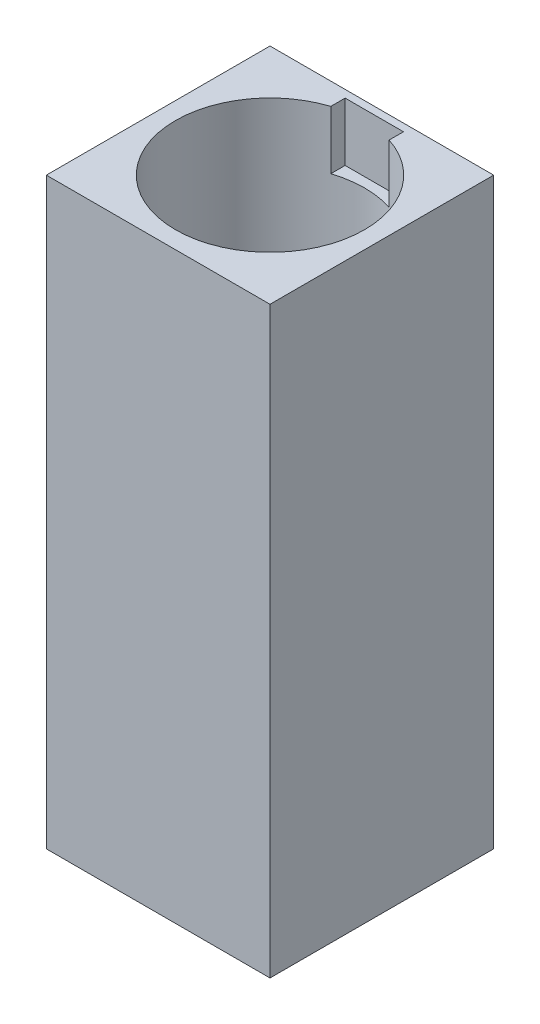
ISO-10303-21;
HEADER;
FILE_DESCRIPTION(('STEP AP214'),'2;1');
FILE_NAME('part.step','',(''),(''),'','','');
FILE_SCHEMA(('AUTOMOTIVE_DESIGN { 1 0 10303 214 1 1 1 1 }'));
ENDSEC;
DATA;
#1=APPLICATION_CONTEXT('core data for automotive mechanical design processes');
#2=APPLICATION_PROTOCOL_DEFINITION('international standard','automotive_design',2000,#1);
#3=PRODUCT_CONTEXT('',#1,'mechanical');
#4=PRODUCT('Part','Part','',(#3));
#5=PRODUCT_RELATED_PRODUCT_CATEGORY('part','',(#4));
#6=PRODUCT_DEFINITION_FORMATION('','',#4);
#7=PRODUCT_DEFINITION_CONTEXT('part definition',#1,'design');
#8=PRODUCT_DEFINITION('design','',#6,#7);
#9=PRODUCT_DEFINITION_SHAPE('','',#8);
#10=(LENGTH_UNIT() NAMED_UNIT(*) SI_UNIT(.MILLI.,.METRE.));
#11=(NAMED_UNIT(*) PLANE_ANGLE_UNIT() SI_UNIT($,.RADIAN.));
#12=(NAMED_UNIT(*) SI_UNIT($,.STERADIAN.) SOLID_ANGLE_UNIT());
#13=UNCERTAINTY_MEASURE_WITH_UNIT(LENGTH_MEASURE(1.E-05),#10,'distance_accuracy_value','');
#14=(GEOMETRIC_REPRESENTATION_CONTEXT(3) GLOBAL_UNCERTAINTY_ASSIGNED_CONTEXT((#13)) GLOBAL_UNIT_ASSIGNED_CONTEXT((#10,
#11,#12)) REPRESENTATION_CONTEXT('',''));
#15=CARTESIAN_POINT('',(0.,0.,0.));
#16=DIRECTION('',(0.,0.,1.));
#17=DIRECTION('',(1.,0.,0.));
#18=AXIS2_PLACEMENT_3D('',#15,#16,#17);
#19=CARTESIAN_POINT('',(0.,60.,0.));
#20=DIRECTION('',(0.,-1.,0.));
#21=DIRECTION('',(0.,0.,-1.));
#22=AXIS2_PLACEMENT_3D('',#19,#20,#21);
#23=PLANE('',#22);
#24=DIRECTION('',(0.,0.,-1.));
#25=VECTOR('',#24,1.);
#26=CARTESIAN_POINT('',(0.,60.,0.));
#27=LINE('',#26,#25);
#28=CARTESIAN_POINT('',(0.,60.,23.));
#29=VERTEX_POINT('',#28);
#30=CARTESIAN_POINT('',(0.,60.,0.));
#31=VERTEX_POINT('',#30);
#32=EDGE_CURVE('E154',#29,#31,#27,.T.);
#33=ORIENTED_EDGE('',*,*,#32,.T.);
#34=DIRECTION('',(-1.,0.,0.));
#35=VECTOR('',#34,1.);
#36=CARTESIAN_POINT('',(0.,60.,0.));
#37=LINE('',#36,#35);
#38=CARTESIAN_POINT('',(-23.,60.,0.));
#39=VERTEX_POINT('',#38);
#40=EDGE_CURVE('E91',#31,#39,#37,.T.);
#41=ORIENTED_EDGE('',*,*,#40,.T.);
#42=DIRECTION('',(0.,0.,1.));
#43=VECTOR('',#42,1.);
#44=CARTESIAN_POINT('',(-23.,60.,0.));
#45=LINE('',#44,#43);
#46=CARTESIAN_POINT('',(-23.,60.,23.));
#47=VERTEX_POINT('',#46);
#48=EDGE_CURVE('E157',#39,#47,#45,.T.);
#49=ORIENTED_EDGE('',*,*,#48,.T.);
#50=DIRECTION('',(1.,0.,0.));
#51=VECTOR('',#50,1.);
#52=CARTESIAN_POINT('',(0.,60.,23.));
#53=LINE('',#52,#51);
#54=EDGE_CURVE('E62',#47,#29,#53,.T.);
#55=ORIENTED_EDGE('',*,*,#54,.T.);
#56=EDGE_LOOP('',(#33,#41,#49,#55));
#57=FACE_BOUND('',#56,.T.);
#58=DIRECTION('',(0.,0.,-1.));
#59=VECTOR('',#58,1.);
#60=CARTESIAN_POINT('',(-14.5,60.,3.17371727131037));
#61=LINE('',#60,#59);
#62=CARTESIAN_POINT('',(-14.5,60.,2.24929056774563));
#63=VERTEX_POINT('',#62);
#64=CARTESIAN_POINT('',(-14.5,60.,0.775000000000002));
#65=VERTEX_POINT('',#64);
#66=EDGE_CURVE('E137',#63,#65,#61,.T.);
#67=ORIENTED_EDGE('',*,*,#66,.T.);
#68=DIRECTION('',(-1.,0.,0.));
#69=VECTOR('',#68,1.);
#70=CARTESIAN_POINT('',(-8.5,60.,0.775));
#71=LINE('',#70,#69);
#72=CARTESIAN_POINT('',(-8.5,60.,0.775));
#73=VERTEX_POINT('',#72);
#74=EDGE_CURVE('E125',#73,#65,#71,.T.);
#75=ORIENTED_EDGE('',*,*,#74,.F.);
#76=DIRECTION('',(0.,0.,-1.));
#77=VECTOR('',#76,1.);
#78=CARTESIAN_POINT('',(-8.5,60.,3.17371727131037));
#79=LINE('',#78,#77);
#80=CARTESIAN_POINT('',(-8.5,60.,2.24929056774563));
#81=VERTEX_POINT('',#80);
#82=EDGE_CURVE('E118',#81,#73,#79,.T.);
#83=ORIENTED_EDGE('',*,*,#82,.F.);
#84=CARTESIAN_POINT('',(-11.5,60.,11.5));
#85=DIRECTION('',(0.,1.,0.));
#86=DIRECTION('',(0.,0.,1.));
#87=AXIS2_PLACEMENT_3D('',#84,#85,#86);
#88=CIRCLE('',#87,9.725);
#89=EDGE_CURVE('E145',#63,#81,#88,.T.);
#90=ORIENTED_EDGE('',*,*,#89,.F.);
#91=EDGE_LOOP('',(#67,#75,#83,#90));
#92=FACE_BOUND('',#91,.T.);
#93=ADVANCED_FACE('F39',(#57,#92),#23,.F.);
#94=CARTESIAN_POINT('',(-11.5,21.,11.5));
#95=DIRECTION('',(0.,1.,0.));
#96=DIRECTION('',(0.,0.,1.));
#97=AXIS2_PLACEMENT_3D('',#94,#95,#96);
#98=CYLINDRICAL_SURFACE('',#97,9.725);
#99=CARTESIAN_POINT('',(-11.5,21.,11.5));
#100=DIRECTION('',(0.,1.,0.));
#101=DIRECTION('',(0.,0.,1.));
#102=AXIS2_PLACEMENT_3D('',#99,#100,#101);
#103=CIRCLE('',#102,9.725);
#104=CARTESIAN_POINT('',(-11.5,21.,21.225));
#105=VERTEX_POINT('',#104);
#106=EDGE_CURVE('E148',#105,#105,#103,.T.);
#107=ORIENTED_EDGE('',*,*,#106,.F.);
#108=EDGE_LOOP('',(#107));
#109=FACE_BOUND('',#108,.T.);
#110=DIRECTION('',(0.,1.,0.));
#111=VECTOR('',#110,1.);
#112=CARTESIAN_POINT('',(-14.5,21.,2.24929056774563));
#113=LINE('',#112,#111);
#114=CARTESIAN_POINT('',(-14.5,54.,2.24929056774563));
#115=VERTEX_POINT('',#114);
#116=EDGE_CURVE('E11',#63,#115,#113,.F.);
#117=ORIENTED_EDGE('',*,*,#116,.F.);
#118=ORIENTED_EDGE('',*,*,#89,.T.);
#119=DIRECTION('',(0.,1.,0.));
#120=VECTOR('',#119,1.);
#121=CARTESIAN_POINT('',(-8.5,21.,2.24929056774563));
#122=LINE('',#121,#120);
#123=CARTESIAN_POINT('',(-8.5,54.,2.24929056774563));
#124=VERTEX_POINT('',#123);
#125=EDGE_CURVE('E47',#81,#124,#122,.F.);
#126=ORIENTED_EDGE('',*,*,#125,.T.);
#127=CARTESIAN_POINT('',(-11.5,54.,11.5));
#128=DIRECTION('',(0.,-1.,0.));
#129=DIRECTION('',(0.,0.,-1.));
#130=AXIS2_PLACEMENT_3D('',#127,#128,#129);
#131=CIRCLE('',#130,9.725);
#132=EDGE_CURVE('E176',#124,#115,#131,.F.);
#133=ORIENTED_EDGE('',*,*,#132,.T.);
#134=EDGE_LOOP('',(#117,#118,#126,#133));
#135=FACE_BOUND('',#134,.T.);
#136=ADVANCED_FACE('F179',(#109,#135),#98,.F.);
#137=CARTESIAN_POINT('',(0.,60.,0.));
#138=DIRECTION('',(-1.,0.,0.));
#139=DIRECTION('',(0.,0.,1.));
#140=AXIS2_PLACEMENT_3D('',#137,#138,#139);
#141=PLANE('',#140);
#142=DIRECTION('',(0.,0.,-1.));
#143=VECTOR('',#142,1.);
#144=CARTESIAN_POINT('',(0.,0.,0.));
#145=LINE('',#144,#143);
#146=CARTESIAN_POINT('',(0.,0.,23.));
#147=VERTEX_POINT('',#146);
#148=CARTESIAN_POINT('',(0.,0.,0.));
#149=VERTEX_POINT('',#148);
#150=EDGE_CURVE('E151',#147,#149,#145,.T.);
#151=ORIENTED_EDGE('',*,*,#150,.T.);
#152=DIRECTION('',(0.,-1.,0.));
#153=VECTOR('',#152,1.);
#154=CARTESIAN_POINT('',(0.,60.,0.));
#155=LINE('',#154,#153);
#156=EDGE_CURVE('E174',#31,#149,#155,.T.);
#157=ORIENTED_EDGE('',*,*,#156,.F.);
#158=ORIENTED_EDGE('',*,*,#32,.F.);
#159=DIRECTION('',(0.,-1.,0.));
#160=VECTOR('',#159,1.);
#161=CARTESIAN_POINT('',(0.,60.,23.));
#162=LINE('',#161,#160);
#163=EDGE_CURVE('E160',#29,#147,#162,.T.);
#164=ORIENTED_EDGE('',*,*,#163,.T.);
#165=EDGE_LOOP('',(#151,#157,#158,#164));
#166=FACE_BOUND('',#165,.T.);
#167=ADVANCED_FACE('F41',(#166),#141,.F.);
#168=CARTESIAN_POINT('',(0.,60.,0.));
#169=DIRECTION('',(0.,0.,1.));
#170=DIRECTION('',(1.,0.,0.));
#171=AXIS2_PLACEMENT_3D('',#168,#169,#170);
#172=PLANE('',#171);
#173=DIRECTION('',(-1.,0.,0.));
#174=VECTOR('',#173,1.);
#175=CARTESIAN_POINT('',(0.,0.,0.));
#176=LINE('',#175,#174);
#177=CARTESIAN_POINT('',(-23.,0.,0.));
#178=VERTEX_POINT('',#177);
#179=EDGE_CURVE('E163',#149,#178,#176,.T.);
#180=ORIENTED_EDGE('',*,*,#179,.T.);
#181=DIRECTION('',(0.,-1.,0.));
#182=VECTOR('',#181,1.);
#183=CARTESIAN_POINT('',(-23.,60.,0.));
#184=LINE('',#183,#182);
#185=EDGE_CURVE('E171',#39,#178,#184,.T.);
#186=ORIENTED_EDGE('',*,*,#185,.F.);
#187=ORIENTED_EDGE('',*,*,#40,.F.);
#188=ORIENTED_EDGE('',*,*,#156,.T.);
#189=EDGE_LOOP('',(#180,#186,#187,#188));
#190=FACE_BOUND('',#189,.T.);
#191=ADVANCED_FACE('F205',(#190),#172,.F.);
#192=CARTESIAN_POINT('',(-23.,60.,0.));
#193=DIRECTION('',(1.,0.,0.));
#194=DIRECTION('',(0.,0.,-1.));
#195=AXIS2_PLACEMENT_3D('',#192,#193,#194);
#196=PLANE('',#195);
#197=DIRECTION('',(0.,0.,1.));
#198=VECTOR('',#197,1.);
#199=CARTESIAN_POINT('',(-23.,0.,0.));
#200=LINE('',#199,#198);
#201=CARTESIAN_POINT('',(-23.,0.,23.));
#202=VERTEX_POINT('',#201);
#203=EDGE_CURVE('E165',#178,#202,#200,.T.);
#204=ORIENTED_EDGE('',*,*,#203,.T.);
#205=DIRECTION('',(0.,-1.,0.));
#206=VECTOR('',#205,1.);
#207=CARTESIAN_POINT('',(-23.,60.,23.));
#208=LINE('',#207,#206);
#209=EDGE_CURVE('E169',#47,#202,#208,.T.);
#210=ORIENTED_EDGE('',*,*,#209,.F.);
#211=ORIENTED_EDGE('',*,*,#48,.F.);
#212=ORIENTED_EDGE('',*,*,#185,.T.);
#213=EDGE_LOOP('',(#204,#210,#211,#212));
#214=FACE_BOUND('',#213,.T.);
#215=ADVANCED_FACE('F203',(#214),#196,.F.);
#216=CARTESIAN_POINT('',(0.,60.,23.));
#217=DIRECTION('',(0.,0.,-1.));
#218=DIRECTION('',(-1.,0.,0.));
#219=AXIS2_PLACEMENT_3D('',#216,#217,#218);
#220=PLANE('',#219);
#221=DIRECTION('',(1.,0.,0.));
#222=VECTOR('',#221,1.);
#223=CARTESIAN_POINT('',(0.,0.,23.));
#224=LINE('',#223,#222);
#225=EDGE_CURVE('E83',#202,#147,#224,.T.);
#226=ORIENTED_EDGE('',*,*,#225,.T.);
#227=ORIENTED_EDGE('',*,*,#163,.F.);
#228=ORIENTED_EDGE('',*,*,#54,.F.);
#229=ORIENTED_EDGE('',*,*,#209,.T.);
#230=EDGE_LOOP('',(#226,#227,#228,#229));
#231=FACE_BOUND('',#230,.T.);
#232=ADVANCED_FACE('F199',(#231),#220,.F.);
#233=CARTESIAN_POINT('',(0.,0.,0.));
#234=DIRECTION('',(0.,-1.,0.));
#235=DIRECTION('',(0.,0.,-1.));
#236=AXIS2_PLACEMENT_3D('',#233,#234,#235);
#237=PLANE('',#236);
#238=CARTESIAN_POINT('',(-11.5,0.,11.5));
#239=DIRECTION('',(0.,1.,0.));
#240=DIRECTION('',(0.,0.,1.));
#241=AXIS2_PLACEMENT_3D('',#238,#239,#240);
#242=CIRCLE('',#241,6.75);
#243=CARTESIAN_POINT('',(-11.5,0.,18.25));
#244=VERTEX_POINT('',#243);
#245=EDGE_CURVE('E142',#244,#244,#242,.T.);
#246=ORIENTED_EDGE('',*,*,#245,.T.);
#247=EDGE_LOOP('',(#246));
#248=FACE_BOUND('',#247,.T.);
#249=ORIENTED_EDGE('',*,*,#150,.F.);
#250=ORIENTED_EDGE('',*,*,#225,.F.);
#251=ORIENTED_EDGE('',*,*,#203,.F.);
#252=ORIENTED_EDGE('',*,*,#179,.F.);
#253=EDGE_LOOP('',(#249,#250,#251,#252));
#254=FACE_BOUND('',#253,.T.);
#255=ADVANCED_FACE('F195',(#248,#254),#237,.T.);
#256=CARTESIAN_POINT('',(-11.5,21.,11.5));
#257=DIRECTION('',(0.,1.,0.));
#258=DIRECTION('',(0.,0.,1.));
#259=AXIS2_PLACEMENT_3D('',#256,#257,#258);
#260=PLANE('',#259);
#261=CARTESIAN_POINT('',(-11.5,21.,11.5));
#262=DIRECTION('',(0.,1.,0.));
#263=DIRECTION('',(0.,0.,1.));
#264=AXIS2_PLACEMENT_3D('',#261,#262,#263);
#265=CIRCLE('',#264,6.75);
#266=CARTESIAN_POINT('',(-11.5,21.,18.25));
#267=VERTEX_POINT('',#266);
#268=EDGE_CURVE('E127',#267,#267,#265,.T.);
#269=ORIENTED_EDGE('',*,*,#268,.F.);
#270=EDGE_LOOP('',(#269));
#271=FACE_BOUND('',#270,.T.);
#272=ORIENTED_EDGE('',*,*,#106,.T.);
#273=EDGE_LOOP('',(#272));
#274=FACE_BOUND('',#273,.T.);
#275=ADVANCED_FACE('F198',(#271,#274),#260,.T.);
#276=CARTESIAN_POINT('',(-11.5,0.,11.5));
#277=DIRECTION('',(0.,1.,0.));
#278=DIRECTION('',(0.,0.,1.));
#279=AXIS2_PLACEMENT_3D('',#276,#277,#278);
#280=CYLINDRICAL_SURFACE('',#279,6.75);
#281=ORIENTED_EDGE('',*,*,#245,.F.);
#282=EDGE_LOOP('',(#281));
#283=FACE_BOUND('',#282,.T.);
#284=ORIENTED_EDGE('',*,*,#268,.T.);
#285=EDGE_LOOP('',(#284));
#286=FACE_BOUND('',#285,.T.);
#287=ADVANCED_FACE('F253',(#283,#286),#280,.F.);
#288=CARTESIAN_POINT('',(-14.5,54.,3.17371727131037));
#289=DIRECTION('',(1.,0.,0.));
#290=DIRECTION('',(0.,0.,-1.));
#291=AXIS2_PLACEMENT_3D('',#288,#289,#290);
#292=PLANE('',#291);
#293=ORIENTED_EDGE('',*,*,#116,.T.);
#294=DIRECTION('',(0.,0.,-1.));
#295=VECTOR('',#294,1.);
#296=CARTESIAN_POINT('',(-14.5,54.,3.17371727131037));
#297=LINE('',#296,#295);
#298=CARTESIAN_POINT('',(-14.5,54.,0.775000000000002));
#299=VERTEX_POINT('',#298);
#300=EDGE_CURVE('E54',#115,#299,#297,.T.);
#301=ORIENTED_EDGE('',*,*,#300,.T.);
#302=DIRECTION('',(0.,1.,0.));
#303=VECTOR('',#302,1.);
#304=CARTESIAN_POINT('',(-14.5,54.,0.775000000000002));
#305=LINE('',#304,#303);
#306=EDGE_CURVE('E113',#299,#65,#305,.T.);
#307=ORIENTED_EDGE('',*,*,#306,.T.);
#308=ORIENTED_EDGE('',*,*,#66,.F.);
#309=EDGE_LOOP('',(#293,#301,#307,#308));
#310=FACE_BOUND('',#309,.T.);
#311=ADVANCED_FACE('F112',(#310),#292,.T.);
#312=CARTESIAN_POINT('',(-8.5,54.,3.17371727131037));
#313=DIRECTION('',(1.,0.,0.));
#314=DIRECTION('',(0.,0.,-1.));
#315=AXIS2_PLACEMENT_3D('',#312,#313,#314);
#316=PLANE('',#315);
#317=ORIENTED_EDGE('',*,*,#82,.T.);
#318=DIRECTION('',(0.,1.,0.));
#319=VECTOR('',#318,1.);
#320=CARTESIAN_POINT('',(-8.5,54.,0.775));
#321=LINE('',#320,#319);
#322=CARTESIAN_POINT('',(-8.5,54.,0.775));
#323=VERTEX_POINT('',#322);
#324=EDGE_CURVE('E128',#323,#73,#321,.T.);
#325=ORIENTED_EDGE('',*,*,#324,.F.);
#326=DIRECTION('',(0.,0.,-1.));
#327=VECTOR('',#326,1.);
#328=CARTESIAN_POINT('',(-8.5,54.,3.17371727131037));
#329=LINE('',#328,#327);
#330=EDGE_CURVE('E132',#124,#323,#329,.T.);
#331=ORIENTED_EDGE('',*,*,#330,.F.);
#332=ORIENTED_EDGE('',*,*,#125,.F.);
#333=EDGE_LOOP('',(#317,#325,#331,#332));
#334=FACE_BOUND('',#333,.T.);
#335=ADVANCED_FACE('F183',(#334),#316,.F.);
#336=CARTESIAN_POINT('',(0.,54.,0.));
#337=DIRECTION('',(0.,-1.,0.));
#338=DIRECTION('',(0.,0.,-1.));
#339=AXIS2_PLACEMENT_3D('',#336,#337,#338);
#340=PLANE('',#339);
#341=ORIENTED_EDGE('',*,*,#330,.T.);
#342=DIRECTION('',(-1.,0.,0.));
#343=VECTOR('',#342,1.);
#344=CARTESIAN_POINT('',(-8.5,54.,0.775));
#345=LINE('',#344,#343);
#346=EDGE_CURVE('E117',#323,#299,#345,.T.);
#347=ORIENTED_EDGE('',*,*,#346,.T.);
#348=ORIENTED_EDGE('',*,*,#300,.F.);
#349=ORIENTED_EDGE('',*,*,#132,.F.);
#350=EDGE_LOOP('',(#341,#347,#348,#349));
#351=FACE_BOUND('',#350,.T.);
#352=ADVANCED_FACE('F130',(#351),#340,.F.);
#353=CARTESIAN_POINT('',(-8.5,54.,0.775));
#354=DIRECTION('',(0.,0.,-1.));
#355=DIRECTION('',(-1.,0.,0.));
#356=AXIS2_PLACEMENT_3D('',#353,#354,#355);
#357=PLANE('',#356);
#358=ORIENTED_EDGE('',*,*,#74,.T.);
#359=ORIENTED_EDGE('',*,*,#306,.F.);
#360=ORIENTED_EDGE('',*,*,#346,.F.);
#361=ORIENTED_EDGE('',*,*,#324,.T.);
#362=EDGE_LOOP('',(#358,#359,#360,#361));
#363=FACE_BOUND('',#362,.T.);
#364=ADVANCED_FACE('F122',(#363),#357,.F.);
#365=CLOSED_SHELL('',(#93,#136,#167,#191,#215,#232,#255,#275,#287,#311,#335,#352,#364));
#366=MANIFOLD_SOLID_BREP('B2',#365);
#367=ADVANCED_BREP_SHAPE_REPRESENTATION('',(#18,#366),#14);
#368=SHAPE_DEFINITION_REPRESENTATION(#9,#367);
ENDSEC;
END-ISO-10303-21;
